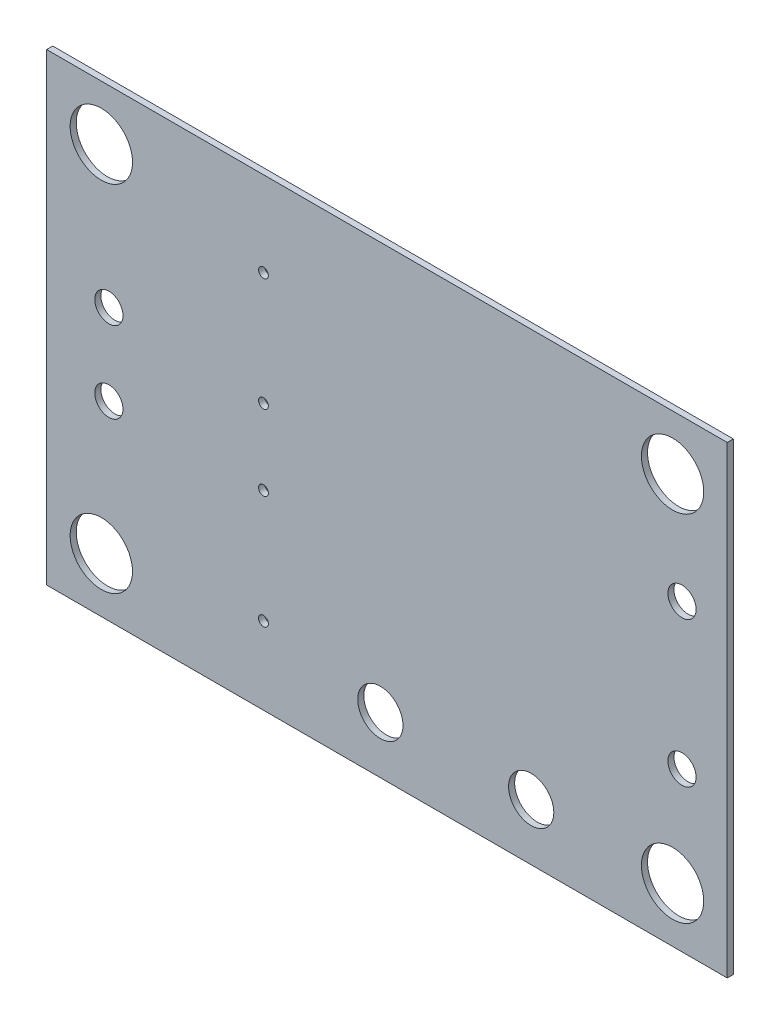
ISO-10303-21;
HEADER;
FILE_DESCRIPTION(('STEP AP214'),'2;1');
FILE_NAME('part.step','',(''),(''),'','','');
FILE_SCHEMA(('AUTOMOTIVE_DESIGN { 1 0 10303 214 1 1 1 1 }'));
ENDSEC;
DATA;
#1=APPLICATION_CONTEXT('core data for automotive mechanical design processes');
#2=APPLICATION_PROTOCOL_DEFINITION('international standard','automotive_design',2000,#1);
#3=PRODUCT_CONTEXT('',#1,'mechanical');
#4=PRODUCT('Part','Part','',(#3));
#5=PRODUCT_RELATED_PRODUCT_CATEGORY('part','',(#4));
#6=PRODUCT_DEFINITION_FORMATION('','',#4);
#7=PRODUCT_DEFINITION_CONTEXT('part definition',#1,'design');
#8=PRODUCT_DEFINITION('design','',#6,#7);
#9=PRODUCT_DEFINITION_SHAPE('','',#8);
#10=(LENGTH_UNIT() NAMED_UNIT(*) SI_UNIT(.MILLI.,.METRE.));
#11=(NAMED_UNIT(*) PLANE_ANGLE_UNIT() SI_UNIT($,.RADIAN.));
#12=(NAMED_UNIT(*) SI_UNIT($,.STERADIAN.) SOLID_ANGLE_UNIT());
#13=UNCERTAINTY_MEASURE_WITH_UNIT(LENGTH_MEASURE(1.E-05),#10,'distance_accuracy_value','');
#14=(GEOMETRIC_REPRESENTATION_CONTEXT(3) GLOBAL_UNCERTAINTY_ASSIGNED_CONTEXT((#13)) GLOBAL_UNIT_ASSIGNED_CONTEXT((#10,
#11,#12)) REPRESENTATION_CONTEXT('',''));
#15=CARTESIAN_POINT('',(0.,0.,0.));
#16=DIRECTION('',(0.,0.,1.));
#17=DIRECTION('',(1.,0.,0.));
#18=AXIS2_PLACEMENT_3D('',#15,#16,#17);
#19=CARTESIAN_POINT('',(115.88750076293,66.29400062561,0.41148));
#20=DIRECTION('',(0.,0.,1.));
#21=DIRECTION('',(1.,0.,0.));
#22=AXIS2_PLACEMENT_3D('',#19,#20,#21);
#23=PLANE('',#22);
#24=CARTESIAN_POINT('',(135.128,78.232,0.41148));
#25=DIRECTION('',(0.,0.,1.));
#26=DIRECTION('',(1.,0.,0.));
#27=AXIS2_PLACEMENT_3D('',#24,#25,#26);
#28=CIRCLE('',#27,2.1);
#29=CARTESIAN_POINT('',(137.228,78.232,0.41148));
#30=VERTEX_POINT('',#29);
#31=EDGE_CURVE('E27',#30,#30,#28,.T.);
#32=ORIENTED_EDGE('',*,*,#31,.F.);
#33=EDGE_LOOP('',(#32));
#34=FACE_BOUND('',#33,.T.);
#35=CARTESIAN_POINT('',(135.763,71.12,0.41148));
#36=DIRECTION('',(0.,0.,1.));
#37=DIRECTION('',(1.,0.,0.));
#38=AXIS2_PLACEMENT_3D('',#35,#36,#37);
#39=CIRCLE('',#38,0.952);
#40=CARTESIAN_POINT('',(136.715,71.12,0.41148));
#41=VERTEX_POINT('',#40);
#42=EDGE_CURVE('E193',#41,#41,#39,.T.);
#43=ORIENTED_EDGE('',*,*,#42,.F.);
#44=EDGE_LOOP('',(#43));
#45=FACE_BOUND('',#44,.T.);
#46=CARTESIAN_POINT('',(107.569,76.2,0.41148));
#47=DIRECTION('',(0.,0.,1.));
#48=DIRECTION('',(1.,0.,0.));
#49=AXIS2_PLACEMENT_3D('',#46,#47,#48);
#50=CIRCLE('',#49,0.33);
#51=CARTESIAN_POINT('',(107.899,76.2,0.41148));
#52=VERTEX_POINT('',#51);
#53=EDGE_CURVE('E185',#52,#52,#50,.T.);
#54=ORIENTED_EDGE('',*,*,#53,.F.);
#55=EDGE_LOOP('',(#54));
#56=FACE_BOUND('',#55,.T.);
#57=CARTESIAN_POINT('',(135.763,61.341,0.41148));
#58=DIRECTION('',(0.,0.,1.));
#59=DIRECTION('',(1.,0.,0.));
#60=AXIS2_PLACEMENT_3D('',#57,#58,#59);
#61=CIRCLE('',#60,0.952);
#62=CARTESIAN_POINT('',(136.715,61.341,0.41148));
#63=VERTEX_POINT('',#62);
#64=EDGE_CURVE('E463',#63,#63,#61,.T.);
#65=ORIENTED_EDGE('',*,*,#64,.F.);
#66=EDGE_LOOP('',(#65));
#67=FACE_BOUND('',#66,.T.);
#68=CARTESIAN_POINT('',(135.128,54.356,0.41148));
#69=DIRECTION('',(0.,0.,1.));
#70=DIRECTION('',(1.,0.,0.));
#71=AXIS2_PLACEMENT_3D('',#68,#69,#70);
#72=CIRCLE('',#71,2.1);
#73=CARTESIAN_POINT('',(137.228,54.356,0.41148));
#74=VERTEX_POINT('',#73);
#75=EDGE_CURVE('E205',#74,#74,#72,.T.);
#76=ORIENTED_EDGE('',*,*,#75,.F.);
#77=EDGE_LOOP('',(#76));
#78=FACE_BOUND('',#77,.T.);
#79=CARTESIAN_POINT('',(125.603,54.483,0.41148));
#80=DIRECTION('',(0.,0.,1.));
#81=DIRECTION('',(1.,0.,0.));
#82=AXIS2_PLACEMENT_3D('',#79,#80,#81);
#83=CIRCLE('',#82,1.524);
#84=CARTESIAN_POINT('',(127.127,54.483,0.41148));
#85=VERTEX_POINT('',#84);
#86=EDGE_CURVE('E329',#85,#85,#83,.T.);
#87=ORIENTED_EDGE('',*,*,#86,.F.);
#88=EDGE_LOOP('',(#87));
#89=FACE_BOUND('',#88,.T.);
#90=CARTESIAN_POINT('',(115.443,54.483,0.41148));
#91=DIRECTION('',(0.,0.,1.));
#92=DIRECTION('',(1.,0.,0.));
#93=AXIS2_PLACEMENT_3D('',#90,#91,#92);
#94=CIRCLE('',#93,1.524);
#95=CARTESIAN_POINT('',(116.967,54.483,0.41148));
#96=VERTEX_POINT('',#95);
#97=EDGE_CURVE('E213',#96,#96,#94,.T.);
#98=ORIENTED_EDGE('',*,*,#97,.F.);
#99=EDGE_LOOP('',(#98));
#100=FACE_BOUND('',#99,.T.);
#101=CARTESIAN_POINT('',(107.569,68.58,0.41148));
#102=DIRECTION('',(0.,0.,1.));
#103=DIRECTION('',(1.,0.,0.));
#104=AXIS2_PLACEMENT_3D('',#101,#102,#103);
#105=CIRCLE('',#104,0.33);
#106=CARTESIAN_POINT('',(107.899,68.58,0.41148));
#107=VERTEX_POINT('',#106);
#108=EDGE_CURVE('E231',#107,#107,#105,.T.);
#109=ORIENTED_EDGE('',*,*,#108,.F.);
#110=EDGE_LOOP('',(#109));
#111=FACE_BOUND('',#110,.T.);
#112=CARTESIAN_POINT('',(107.569,63.5,0.41148));
#113=DIRECTION('',(0.,0.,1.));
#114=DIRECTION('',(1.,0.,0.));
#115=AXIS2_PLACEMENT_3D('',#112,#113,#114);
#116=CIRCLE('',#115,0.33);
#117=CARTESIAN_POINT('',(107.899,63.5,0.41148));
#118=VERTEX_POINT('',#117);
#119=EDGE_CURVE('E404',#118,#118,#116,.T.);
#120=ORIENTED_EDGE('',*,*,#119,.F.);
#121=EDGE_LOOP('',(#120));
#122=FACE_BOUND('',#121,.T.);
#123=CARTESIAN_POINT('',(96.647,78.232,0.41148));
#124=DIRECTION('',(0.,0.,1.));
#125=DIRECTION('',(1.,0.,0.));
#126=AXIS2_PLACEMENT_3D('',#123,#124,#125);
#127=CIRCLE('',#126,2.1);
#128=CARTESIAN_POINT('',(98.747,78.232,0.41148));
#129=VERTEX_POINT('',#128);
#130=EDGE_CURVE('E244',#129,#129,#127,.T.);
#131=ORIENTED_EDGE('',*,*,#130,.F.);
#132=EDGE_LOOP('',(#131));
#133=FACE_BOUND('',#132,.T.);
#134=CARTESIAN_POINT('',(97.155,68.961,0.41148));
#135=DIRECTION('',(0.,0.,1.));
#136=DIRECTION('',(1.,0.,0.));
#137=AXIS2_PLACEMENT_3D('',#134,#135,#136);
#138=CIRCLE('',#137,0.952);
#139=CARTESIAN_POINT('',(98.107,68.961,0.41148));
#140=VERTEX_POINT('',#139);
#141=EDGE_CURVE('E302',#140,#140,#138,.T.);
#142=ORIENTED_EDGE('',*,*,#141,.F.);
#143=EDGE_LOOP('',(#142));
#144=FACE_BOUND('',#143,.T.);
#145=CARTESIAN_POINT('',(96.647,54.356,0.41148));
#146=DIRECTION('',(0.,0.,1.));
#147=DIRECTION('',(1.,0.,0.));
#148=AXIS2_PLACEMENT_3D('',#145,#146,#147);
#149=CIRCLE('',#148,2.1);
#150=CARTESIAN_POINT('',(98.747,54.356,0.41148));
#151=VERTEX_POINT('',#150);
#152=EDGE_CURVE('E247',#151,#151,#149,.T.);
#153=ORIENTED_EDGE('',*,*,#152,.F.);
#154=EDGE_LOOP('',(#153));
#155=FACE_BOUND('',#154,.T.);
#156=CARTESIAN_POINT('',(107.569,55.88,0.41148));
#157=DIRECTION('',(0.,0.,1.));
#158=DIRECTION('',(1.,0.,0.));
#159=AXIS2_PLACEMENT_3D('',#156,#157,#158);
#160=CIRCLE('',#159,0.33);
#161=CARTESIAN_POINT('',(107.899,55.88,0.41148));
#162=VERTEX_POINT('',#161);
#163=EDGE_CURVE('E222',#162,#162,#160,.T.);
#164=ORIENTED_EDGE('',*,*,#163,.F.);
#165=EDGE_LOOP('',(#164));
#166=FACE_BOUND('',#165,.T.);
#167=CARTESIAN_POINT('',(97.155,63.5,0.41148));
#168=DIRECTION('',(0.,0.,1.));
#169=DIRECTION('',(1.,0.,0.));
#170=AXIS2_PLACEMENT_3D('',#167,#168,#169);
#171=CIRCLE('',#170,0.952);
#172=CARTESIAN_POINT('',(98.107,63.5,0.41148));
#173=VERTEX_POINT('',#172);
#174=EDGE_CURVE('E293',#173,#173,#171,.T.);
#175=ORIENTED_EDGE('',*,*,#174,.F.);
#176=EDGE_LOOP('',(#175));
#177=FACE_BOUND('',#176,.T.);
#178=DIRECTION('',(1.,0.,0.));
#179=VECTOR('',#178,1.);
#180=CARTESIAN_POINT('',(92.963996887207,50.673000335693,0.41148));
#181=LINE('',#180,#179);
#182=CARTESIAN_POINT('',(92.963996887207,50.673000335693,0.41148));
#183=VERTEX_POINT('',#182);
#184=CARTESIAN_POINT('',(138.81100463867,50.673000335693,0.41148));
#185=VERTEX_POINT('',#184);
#186=EDGE_CURVE('E318',#183,#185,#181,.T.);
#187=ORIENTED_EDGE('',*,*,#186,.T.);
#188=DIRECTION('',(0.,1.,0.));
#189=VECTOR('',#188,1.);
#190=CARTESIAN_POINT('',(138.81100463867,50.673000335693,0.41148));
#191=LINE('',#190,#189);
#192=CARTESIAN_POINT('',(138.81100463867,81.915000915527,0.41148));
#193=VERTEX_POINT('',#192);
#194=EDGE_CURVE('E348',#185,#193,#191,.T.);
#195=ORIENTED_EDGE('',*,*,#194,.T.);
#196=DIRECTION('',(-1.,0.,0.));
#197=VECTOR('',#196,1.);
#198=CARTESIAN_POINT('',(138.81100463867,81.915000915527,0.41148));
#199=LINE('',#198,#197);
#200=CARTESIAN_POINT('',(92.963996887207,81.915000915527,0.41148));
#201=VERTEX_POINT('',#200);
#202=EDGE_CURVE('E20',#193,#201,#199,.T.);
#203=ORIENTED_EDGE('',*,*,#202,.T.);
#204=DIRECTION('',(0.,-1.,0.));
#205=VECTOR('',#204,1.);
#206=CARTESIAN_POINT('',(92.963996887207,81.915000915527,0.41148));
#207=LINE('',#206,#205);
#208=EDGE_CURVE('E223',#201,#183,#207,.T.);
#209=ORIENTED_EDGE('',*,*,#208,.T.);
#210=EDGE_LOOP('',(#187,#195,#203,#209));
#211=FACE_BOUND('',#210,.T.);
#212=ADVANCED_FACE('F16',(#34,#45,#56,#67,#78,#89,#100,#111,#122,#133,#144,#155,#166,#177,#211),
#23,.T.);
#213=CARTESIAN_POINT('',(115.88750076293,66.29400062561,0.));
#214=DIRECTION('',(0.,0.,1.));
#215=DIRECTION('',(1.,0.,0.));
#216=AXIS2_PLACEMENT_3D('',#213,#214,#215);
#217=PLANE('',#216);
#218=CARTESIAN_POINT('',(135.128,78.232,0.));
#219=DIRECTION('',(0.,0.,1.));
#220=DIRECTION('',(1.,0.,0.));
#221=AXIS2_PLACEMENT_3D('',#218,#219,#220);
#222=CIRCLE('',#221,2.1);
#223=CARTESIAN_POINT('',(137.228,78.232,0.));
#224=VERTEX_POINT('',#223);
#225=EDGE_CURVE('E11',#224,#224,#222,.T.);
#226=ORIENTED_EDGE('',*,*,#225,.T.);
#227=EDGE_LOOP('',(#226));
#228=FACE_BOUND('',#227,.T.);
#229=CARTESIAN_POINT('',(135.763,71.12,0.));
#230=DIRECTION('',(0.,0.,1.));
#231=DIRECTION('',(1.,0.,0.));
#232=AXIS2_PLACEMENT_3D('',#229,#230,#231);
#233=CIRCLE('',#232,0.952);
#234=CARTESIAN_POINT('',(136.715,71.12,0.));
#235=VERTEX_POINT('',#234);
#236=EDGE_CURVE('E234',#235,#235,#233,.T.);
#237=ORIENTED_EDGE('',*,*,#236,.T.);
#238=EDGE_LOOP('',(#237));
#239=FACE_BOUND('',#238,.T.);
#240=CARTESIAN_POINT('',(107.569,76.2,0.));
#241=DIRECTION('',(0.,0.,1.));
#242=DIRECTION('',(1.,0.,0.));
#243=AXIS2_PLACEMENT_3D('',#240,#241,#242);
#244=CIRCLE('',#243,0.33);
#245=CARTESIAN_POINT('',(107.899,76.2,0.));
#246=VERTEX_POINT('',#245);
#247=EDGE_CURVE('E177',#246,#246,#244,.T.);
#248=ORIENTED_EDGE('',*,*,#247,.T.);
#249=EDGE_LOOP('',(#248));
#250=FACE_BOUND('',#249,.T.);
#251=CARTESIAN_POINT('',(135.763,61.341,0.));
#252=DIRECTION('',(0.,0.,1.));
#253=DIRECTION('',(1.,0.,0.));
#254=AXIS2_PLACEMENT_3D('',#251,#252,#253);
#255=CIRCLE('',#254,0.952);
#256=CARTESIAN_POINT('',(136.715,61.341,0.));
#257=VERTEX_POINT('',#256);
#258=EDGE_CURVE('E450',#257,#257,#255,.T.);
#259=ORIENTED_EDGE('',*,*,#258,.T.);
#260=EDGE_LOOP('',(#259));
#261=FACE_BOUND('',#260,.T.);
#262=CARTESIAN_POINT('',(135.128,54.356,0.));
#263=DIRECTION('',(0.,0.,1.));
#264=DIRECTION('',(1.,0.,0.));
#265=AXIS2_PLACEMENT_3D('',#262,#263,#264);
#266=CIRCLE('',#265,2.1);
#267=CARTESIAN_POINT('',(137.228,54.356,0.));
#268=VERTEX_POINT('',#267);
#269=EDGE_CURVE('E483',#268,#268,#266,.T.);
#270=ORIENTED_EDGE('',*,*,#269,.T.);
#271=EDGE_LOOP('',(#270));
#272=FACE_BOUND('',#271,.T.);
#273=CARTESIAN_POINT('',(125.603,54.483,0.));
#274=DIRECTION('',(0.,0.,1.));
#275=DIRECTION('',(1.,0.,0.));
#276=AXIS2_PLACEMENT_3D('',#273,#274,#275);
#277=CIRCLE('',#276,1.524);
#278=CARTESIAN_POINT('',(127.127,54.483,0.));
#279=VERTEX_POINT('',#278);
#280=EDGE_CURVE('E206',#279,#279,#277,.T.);
#281=ORIENTED_EDGE('',*,*,#280,.T.);
#282=EDGE_LOOP('',(#281));
#283=FACE_BOUND('',#282,.T.);
#284=CARTESIAN_POINT('',(115.443,54.483,0.));
#285=DIRECTION('',(0.,0.,1.));
#286=DIRECTION('',(1.,0.,0.));
#287=AXIS2_PLACEMENT_3D('',#284,#285,#286);
#288=CIRCLE('',#287,1.524);
#289=CARTESIAN_POINT('',(116.967,54.483,0.));
#290=VERTEX_POINT('',#289);
#291=EDGE_CURVE('E216',#290,#290,#288,.T.);
#292=ORIENTED_EDGE('',*,*,#291,.T.);
#293=EDGE_LOOP('',(#292));
#294=FACE_BOUND('',#293,.T.);
#295=CARTESIAN_POINT('',(107.569,68.58,0.));
#296=DIRECTION('',(0.,0.,1.));
#297=DIRECTION('',(1.,0.,0.));
#298=AXIS2_PLACEMENT_3D('',#295,#296,#297);
#299=CIRCLE('',#298,0.33);
#300=CARTESIAN_POINT('',(107.899,68.58,0.));
#301=VERTEX_POINT('',#300);
#302=EDGE_CURVE('E228',#301,#301,#299,.T.);
#303=ORIENTED_EDGE('',*,*,#302,.T.);
#304=EDGE_LOOP('',(#303));
#305=FACE_BOUND('',#304,.T.);
#306=CARTESIAN_POINT('',(107.569,63.5,0.));
#307=DIRECTION('',(0.,0.,1.));
#308=DIRECTION('',(1.,0.,0.));
#309=AXIS2_PLACEMENT_3D('',#306,#307,#308);
#310=CIRCLE('',#309,0.33);
#311=CARTESIAN_POINT('',(107.899,63.5,0.));
#312=VERTEX_POINT('',#311);
#313=EDGE_CURVE('E397',#312,#312,#310,.T.);
#314=ORIENTED_EDGE('',*,*,#313,.T.);
#315=EDGE_LOOP('',(#314));
#316=FACE_BOUND('',#315,.T.);
#317=CARTESIAN_POINT('',(96.647,78.232,0.));
#318=DIRECTION('',(0.,0.,1.));
#319=DIRECTION('',(1.,0.,0.));
#320=AXIS2_PLACEMENT_3D('',#317,#318,#319);
#321=CIRCLE('',#320,2.1);
#322=CARTESIAN_POINT('',(98.747,78.232,0.));
#323=VERTEX_POINT('',#322);
#324=EDGE_CURVE('E240',#323,#323,#321,.T.);
#325=ORIENTED_EDGE('',*,*,#324,.T.);
#326=EDGE_LOOP('',(#325));
#327=FACE_BOUND('',#326,.T.);
#328=CARTESIAN_POINT('',(97.155,68.961,0.));
#329=DIRECTION('',(0.,0.,1.));
#330=DIRECTION('',(1.,0.,0.));
#331=AXIS2_PLACEMENT_3D('',#328,#329,#330);
#332=CIRCLE('',#331,0.952);
#333=CARTESIAN_POINT('',(98.107,68.961,0.));
#334=VERTEX_POINT('',#333);
#335=EDGE_CURVE('E297',#334,#334,#332,.T.);
#336=ORIENTED_EDGE('',*,*,#335,.T.);
#337=EDGE_LOOP('',(#336));
#338=FACE_BOUND('',#337,.T.);
#339=CARTESIAN_POINT('',(96.647,54.356,0.));
#340=DIRECTION('',(0.,0.,1.));
#341=DIRECTION('',(1.,0.,0.));
#342=AXIS2_PLACEMENT_3D('',#339,#340,#341);
#343=CIRCLE('',#342,2.1);
#344=CARTESIAN_POINT('',(98.747,54.356,0.));
#345=VERTEX_POINT('',#344);
#346=EDGE_CURVE('E428',#345,#345,#343,.T.);
#347=ORIENTED_EDGE('',*,*,#346,.T.);
#348=EDGE_LOOP('',(#347));
#349=FACE_BOUND('',#348,.T.);
#350=CARTESIAN_POINT('',(107.569,55.88,0.));
#351=DIRECTION('',(0.,0.,1.));
#352=DIRECTION('',(1.,0.,0.));
#353=AXIS2_PLACEMENT_3D('',#350,#351,#352);
#354=CIRCLE('',#353,0.33);
#355=CARTESIAN_POINT('',(107.899,55.88,0.));
#356=VERTEX_POINT('',#355);
#357=EDGE_CURVE('E218',#356,#356,#354,.T.);
#358=ORIENTED_EDGE('',*,*,#357,.T.);
#359=EDGE_LOOP('',(#358));
#360=FACE_BOUND('',#359,.T.);
#361=CARTESIAN_POINT('',(97.155,63.5,0.));
#362=DIRECTION('',(0.,0.,1.));
#363=DIRECTION('',(1.,0.,0.));
#364=AXIS2_PLACEMENT_3D('',#361,#362,#363);
#365=CIRCLE('',#364,0.952);
#366=CARTESIAN_POINT('',(98.107,63.5,0.));
#367=VERTEX_POINT('',#366);
#368=EDGE_CURVE('E284',#367,#367,#365,.T.);
#369=ORIENTED_EDGE('',*,*,#368,.T.);
#370=EDGE_LOOP('',(#369));
#371=FACE_BOUND('',#370,.T.);
#372=DIRECTION('',(0.,-1.,0.));
#373=VECTOR('',#372,1.);
#374=CARTESIAN_POINT('',(92.963996887207,81.915000915527,0.));
#375=LINE('',#374,#373);
#376=CARTESIAN_POINT('',(92.963996887207,81.915000915527,0.));
#377=VERTEX_POINT('',#376);
#378=CARTESIAN_POINT('',(92.963996887207,50.673000335693,0.));
#379=VERTEX_POINT('',#378);
#380=EDGE_CURVE('E227',#377,#379,#375,.T.);
#381=ORIENTED_EDGE('',*,*,#380,.F.);
#382=DIRECTION('',(-1.,0.,0.));
#383=VECTOR('',#382,1.);
#384=CARTESIAN_POINT('',(138.81100463867,81.915000915527,0.));
#385=LINE('',#384,#383);
#386=CARTESIAN_POINT('',(138.81100463867,81.915000915527,0.));
#387=VERTEX_POINT('',#386);
#388=EDGE_CURVE('E198',#387,#377,#385,.T.);
#389=ORIENTED_EDGE('',*,*,#388,.F.);
#390=DIRECTION('',(0.,1.,0.));
#391=VECTOR('',#390,1.);
#392=CARTESIAN_POINT('',(138.81100463867,50.673000335693,0.));
#393=LINE('',#392,#391);
#394=CARTESIAN_POINT('',(138.81100463867,50.673000335693,0.));
#395=VERTEX_POINT('',#394);
#396=EDGE_CURVE('E207',#395,#387,#393,.T.);
#397=ORIENTED_EDGE('',*,*,#396,.F.);
#398=DIRECTION('',(1.,0.,0.));
#399=VECTOR('',#398,1.);
#400=CARTESIAN_POINT('',(92.963996887207,50.673000335693,0.));
#401=LINE('',#400,#399);
#402=EDGE_CURVE('E319',#379,#395,#401,.T.);
#403=ORIENTED_EDGE('',*,*,#402,.F.);
#404=EDGE_LOOP('',(#381,#389,#397,#403));
#405=FACE_BOUND('',#404,.T.);
#406=ADVANCED_FACE('F178',(#228,#239,#250,#261,#272,#283,#294,#305,#316,#327,#338,#349,#360,
#371,#405),#217,.F.);
#407=CARTESIAN_POINT('',(135.128,78.232,0.));
#408=DIRECTION('',(0.,0.,-1.));
#409=DIRECTION('',(1.,0.,0.));
#410=AXIS2_PLACEMENT_3D('',#407,#408,#409);
#411=CYLINDRICAL_SURFACE('',#410,2.1);
#412=DIRECTION('',(0.,0.,1.));
#413=VECTOR('',#412,1.);
#414=CARTESIAN_POINT('',(137.228,78.232,0.));
#415=LINE('',#414,#413);
#416=EDGE_CURVE('E237',#224,#30,#415,.T.);
#417=ORIENTED_EDGE('',*,*,#416,.T.);
#418=ORIENTED_EDGE('',*,*,#31,.T.);
#419=ORIENTED_EDGE('',*,*,#416,.F.);
#420=ORIENTED_EDGE('',*,*,#225,.F.);
#421=EDGE_LOOP('',(#417,#418,#419,#420));
#422=FACE_BOUND('',#421,.T.);
#423=ADVANCED_FACE('F546',(#422),#411,.F.);
#424=CARTESIAN_POINT('',(135.763,71.12,0.));
#425=DIRECTION('',(0.,0.,-1.));
#426=DIRECTION('',(1.,0.,0.));
#427=AXIS2_PLACEMENT_3D('',#424,#425,#426);
#428=CYLINDRICAL_SURFACE('',#427,0.952);
#429=DIRECTION('',(0.,0.,1.));
#430=VECTOR('',#429,1.);
#431=CARTESIAN_POINT('',(136.715,71.12,0.));
#432=LINE('',#431,#430);
#433=EDGE_CURVE('E184',#235,#41,#432,.T.);
#434=ORIENTED_EDGE('',*,*,#433,.T.);
#435=ORIENTED_EDGE('',*,*,#42,.T.);
#436=ORIENTED_EDGE('',*,*,#433,.F.);
#437=ORIENTED_EDGE('',*,*,#236,.F.);
#438=EDGE_LOOP('',(#434,#435,#436,#437));
#439=FACE_BOUND('',#438,.T.);
#440=ADVANCED_FACE('F620',(#439),#428,.F.);
#441=CARTESIAN_POINT('',(107.569,76.2,0.));
#442=DIRECTION('',(0.,0.,-1.));
#443=DIRECTION('',(1.,0.,0.));
#444=AXIS2_PLACEMENT_3D('',#441,#442,#443);
#445=CYLINDRICAL_SURFACE('',#444,0.33);
#446=DIRECTION('',(0.,0.,1.));
#447=VECTOR('',#446,1.);
#448=CARTESIAN_POINT('',(107.899,76.2,0.));
#449=LINE('',#448,#447);
#450=EDGE_CURVE('E195',#246,#52,#449,.T.);
#451=ORIENTED_EDGE('',*,*,#450,.T.);
#452=ORIENTED_EDGE('',*,*,#53,.T.);
#453=ORIENTED_EDGE('',*,*,#450,.F.);
#454=ORIENTED_EDGE('',*,*,#247,.F.);
#455=EDGE_LOOP('',(#451,#452,#453,#454));
#456=FACE_BOUND('',#455,.T.);
#457=ADVANCED_FACE('F571',(#456),#445,.F.);
#458=CARTESIAN_POINT('',(135.763,61.341,0.));
#459=DIRECTION('',(0.,0.,-1.));
#460=DIRECTION('',(1.,0.,0.));
#461=AXIS2_PLACEMENT_3D('',#458,#459,#460);
#462=CYLINDRICAL_SURFACE('',#461,0.952);
#463=DIRECTION('',(0.,0.,1.));
#464=VECTOR('',#463,1.);
#465=CARTESIAN_POINT('',(136.715,61.341,0.));
#466=LINE('',#465,#464);
#467=EDGE_CURVE('E467',#257,#63,#466,.T.);
#468=ORIENTED_EDGE('',*,*,#467,.T.);
#469=ORIENTED_EDGE('',*,*,#64,.T.);
#470=ORIENTED_EDGE('',*,*,#467,.F.);
#471=ORIENTED_EDGE('',*,*,#258,.F.);
#472=EDGE_LOOP('',(#468,#469,#470,#471));
#473=FACE_BOUND('',#472,.T.);
#474=ADVANCED_FACE('F565',(#473),#462,.F.);
#475=CARTESIAN_POINT('',(135.128,54.356,0.));
#476=DIRECTION('',(0.,0.,-1.));
#477=DIRECTION('',(1.,0.,0.));
#478=AXIS2_PLACEMENT_3D('',#475,#476,#477);
#479=CYLINDRICAL_SURFACE('',#478,2.1);
#480=DIRECTION('',(0.,0.,1.));
#481=VECTOR('',#480,1.);
#482=CARTESIAN_POINT('',(137.228,54.356,0.));
#483=LINE('',#482,#481);
#484=EDGE_CURVE('E201',#268,#74,#483,.T.);
#485=ORIENTED_EDGE('',*,*,#484,.T.);
#486=ORIENTED_EDGE('',*,*,#75,.T.);
#487=ORIENTED_EDGE('',*,*,#484,.F.);
#488=ORIENTED_EDGE('',*,*,#269,.F.);
#489=EDGE_LOOP('',(#485,#486,#487,#488));
#490=FACE_BOUND('',#489,.T.);
#491=ADVANCED_FACE('F570',(#490),#479,.F.);
#492=CARTESIAN_POINT('',(125.603,54.483,0.));
#493=DIRECTION('',(0.,0.,-1.));
#494=DIRECTION('',(1.,0.,0.));
#495=AXIS2_PLACEMENT_3D('',#492,#493,#494);
#496=CYLINDRICAL_SURFACE('',#495,1.524);
#497=DIRECTION('',(0.,0.,1.));
#498=VECTOR('',#497,1.);
#499=CARTESIAN_POINT('',(127.127,54.483,0.));
#500=LINE('',#499,#498);
#501=EDGE_CURVE('E324',#279,#85,#500,.T.);
#502=ORIENTED_EDGE('',*,*,#501,.T.);
#503=ORIENTED_EDGE('',*,*,#86,.T.);
#504=ORIENTED_EDGE('',*,*,#501,.F.);
#505=ORIENTED_EDGE('',*,*,#280,.F.);
#506=EDGE_LOOP('',(#502,#503,#504,#505));
#507=FACE_BOUND('',#506,.T.);
#508=ADVANCED_FACE('F581',(#507),#496,.F.);
#509=CARTESIAN_POINT('',(115.443,54.483,0.));
#510=DIRECTION('',(0.,0.,-1.));
#511=DIRECTION('',(1.,0.,0.));
#512=AXIS2_PLACEMENT_3D('',#509,#510,#511);
#513=CYLINDRICAL_SURFACE('',#512,1.524);
#514=DIRECTION('',(0.,0.,1.));
#515=VECTOR('',#514,1.);
#516=CARTESIAN_POINT('',(116.967,54.483,0.));
#517=LINE('',#516,#515);
#518=EDGE_CURVE('E217',#290,#96,#517,.T.);
#519=ORIENTED_EDGE('',*,*,#518,.T.);
#520=ORIENTED_EDGE('',*,*,#97,.T.);
#521=ORIENTED_EDGE('',*,*,#518,.F.);
#522=ORIENTED_EDGE('',*,*,#291,.F.);
#523=EDGE_LOOP('',(#519,#520,#521,#522));
#524=FACE_BOUND('',#523,.T.);
#525=ADVANCED_FACE('F645',(#524),#513,.F.);
#526=CARTESIAN_POINT('',(107.569,68.58,0.));
#527=DIRECTION('',(0.,0.,-1.));
#528=DIRECTION('',(1.,0.,0.));
#529=AXIS2_PLACEMENT_3D('',#526,#527,#528);
#530=CYLINDRICAL_SURFACE('',#529,0.33);
#531=DIRECTION('',(0.,0.,1.));
#532=VECTOR('',#531,1.);
#533=CARTESIAN_POINT('',(107.899,68.58,0.));
#534=LINE('',#533,#532);
#535=EDGE_CURVE('E389',#301,#107,#534,.T.);
#536=ORIENTED_EDGE('',*,*,#535,.T.);
#537=ORIENTED_EDGE('',*,*,#108,.T.);
#538=ORIENTED_EDGE('',*,*,#535,.F.);
#539=ORIENTED_EDGE('',*,*,#302,.F.);
#540=EDGE_LOOP('',(#536,#537,#538,#539));
#541=FACE_BOUND('',#540,.T.);
#542=ADVANCED_FACE('F18',(#541),#530,.F.);
#543=CARTESIAN_POINT('',(107.569,63.5,0.));
#544=DIRECTION('',(0.,0.,-1.));
#545=DIRECTION('',(1.,0.,0.));
#546=AXIS2_PLACEMENT_3D('',#543,#544,#545);
#547=CYLINDRICAL_SURFACE('',#546,0.33);
#548=DIRECTION('',(0.,0.,1.));
#549=VECTOR('',#548,1.);
#550=CARTESIAN_POINT('',(107.899,63.5,0.));
#551=LINE('',#550,#549);
#552=EDGE_CURVE('E243',#312,#118,#551,.T.);
#553=ORIENTED_EDGE('',*,*,#552,.T.);
#554=ORIENTED_EDGE('',*,*,#119,.T.);
#555=ORIENTED_EDGE('',*,*,#552,.F.);
#556=ORIENTED_EDGE('',*,*,#313,.F.);
#557=EDGE_LOOP('',(#553,#554,#555,#556));
#558=FACE_BOUND('',#557,.T.);
#559=ADVANCED_FACE('F625',(#558),#547,.F.);
#560=CARTESIAN_POINT('',(96.647,78.232,0.));
#561=DIRECTION('',(0.,0.,-1.));
#562=DIRECTION('',(1.,0.,0.));
#563=AXIS2_PLACEMENT_3D('',#560,#561,#562);
#564=CYLINDRICAL_SURFACE('',#563,2.1);
#565=DIRECTION('',(0.,0.,1.));
#566=VECTOR('',#565,1.);
#567=CARTESIAN_POINT('',(98.747,78.232,0.));
#568=LINE('',#567,#566);
#569=EDGE_CURVE('E301',#323,#129,#568,.T.);
#570=ORIENTED_EDGE('',*,*,#569,.T.);
#571=ORIENTED_EDGE('',*,*,#130,.T.);
#572=ORIENTED_EDGE('',*,*,#569,.F.);
#573=ORIENTED_EDGE('',*,*,#324,.F.);
#574=EDGE_LOOP('',(#570,#571,#572,#573));
#575=FACE_BOUND('',#574,.T.);
#576=ADVANCED_FACE('F600',(#575),#564,.F.);
#577=CARTESIAN_POINT('',(97.155,68.961,0.));
#578=DIRECTION('',(0.,0.,-1.));
#579=DIRECTION('',(1.,0.,0.));
#580=AXIS2_PLACEMENT_3D('',#577,#578,#579);
#581=CYLINDRICAL_SURFACE('',#580,0.952);
#582=DIRECTION('',(0.,0.,1.));
#583=VECTOR('',#582,1.);
#584=CARTESIAN_POINT('',(98.107,68.961,0.));
#585=LINE('',#584,#583);
#586=EDGE_CURVE('E436',#334,#140,#585,.T.);
#587=ORIENTED_EDGE('',*,*,#586,.T.);
#588=ORIENTED_EDGE('',*,*,#141,.T.);
#589=ORIENTED_EDGE('',*,*,#586,.F.);
#590=ORIENTED_EDGE('',*,*,#335,.F.);
#591=EDGE_LOOP('',(#587,#588,#589,#590));
#592=FACE_BOUND('',#591,.T.);
#593=ADVANCED_FACE('F591',(#592),#581,.F.);
#594=CARTESIAN_POINT('',(96.647,54.356,0.));
#595=DIRECTION('',(0.,0.,-1.));
#596=DIRECTION('',(1.,0.,0.));
#597=AXIS2_PLACEMENT_3D('',#594,#595,#596);
#598=CYLINDRICAL_SURFACE('',#597,2.1);
#599=DIRECTION('',(0.,0.,1.));
#600=VECTOR('',#599,1.);
#601=CARTESIAN_POINT('',(98.747,54.356,0.));
#602=LINE('',#601,#600);
#603=EDGE_CURVE('E221',#345,#151,#602,.T.);
#604=ORIENTED_EDGE('',*,*,#603,.T.);
#605=ORIENTED_EDGE('',*,*,#152,.T.);
#606=ORIENTED_EDGE('',*,*,#603,.F.);
#607=ORIENTED_EDGE('',*,*,#346,.F.);
#608=EDGE_LOOP('',(#604,#605,#606,#607));
#609=FACE_BOUND('',#608,.T.);
#610=ADVANCED_FACE('F586',(#609),#598,.F.);
#611=CARTESIAN_POINT('',(107.569,55.88,0.));
#612=DIRECTION('',(0.,0.,-1.));
#613=DIRECTION('',(1.,0.,0.));
#614=AXIS2_PLACEMENT_3D('',#611,#612,#613);
#615=CYLINDRICAL_SURFACE('',#614,0.33);
#616=DIRECTION('',(0.,0.,1.));
#617=VECTOR('',#616,1.);
#618=CARTESIAN_POINT('',(107.899,55.88,0.));
#619=LINE('',#618,#617);
#620=EDGE_CURVE('E279',#356,#162,#619,.T.);
#621=ORIENTED_EDGE('',*,*,#620,.T.);
#622=ORIENTED_EDGE('',*,*,#163,.T.);
#623=ORIENTED_EDGE('',*,*,#620,.F.);
#624=ORIENTED_EDGE('',*,*,#357,.F.);
#625=EDGE_LOOP('',(#621,#622,#623,#624));
#626=FACE_BOUND('',#625,.T.);
#627=ADVANCED_FACE('F513',(#626),#615,.F.);
#628=CARTESIAN_POINT('',(97.155,63.5,0.));
#629=DIRECTION('',(0.,0.,-1.));
#630=DIRECTION('',(1.,0.,0.));
#631=AXIS2_PLACEMENT_3D('',#628,#629,#630);
#632=CYLINDRICAL_SURFACE('',#631,0.952);
#633=DIRECTION('',(0.,0.,1.));
#634=VECTOR('',#633,1.);
#635=CARTESIAN_POINT('',(98.107,63.5,0.));
#636=LINE('',#635,#634);
#637=EDGE_CURVE('E226',#367,#173,#636,.T.);
#638=ORIENTED_EDGE('',*,*,#637,.T.);
#639=ORIENTED_EDGE('',*,*,#174,.T.);
#640=ORIENTED_EDGE('',*,*,#637,.F.);
#641=ORIENTED_EDGE('',*,*,#368,.F.);
#642=EDGE_LOOP('',(#638,#639,#640,#641));
#643=FACE_BOUND('',#642,.T.);
#644=ADVANCED_FACE('F553',(#643),#632,.F.);
#645=CARTESIAN_POINT('',(92.963996887207,81.915000915527,0.));
#646=DIRECTION('',(1.,0.,0.));
#647=DIRECTION('',(0.,1.,0.));
#648=AXIS2_PLACEMENT_3D('',#645,#646,#647);
#649=PLANE('',#648);
#650=ORIENTED_EDGE('',*,*,#380,.T.);
#651=DIRECTION('',(0.,0.,1.));
#652=VECTOR('',#651,1.);
#653=CARTESIAN_POINT('',(92.963996887207,50.673000335693,0.));
#654=LINE('',#653,#652);
#655=EDGE_CURVE('E211',#379,#183,#654,.T.);
#656=ORIENTED_EDGE('',*,*,#655,.T.);
#657=ORIENTED_EDGE('',*,*,#208,.F.);
#658=DIRECTION('',(0.,0.,1.));
#659=VECTOR('',#658,1.);
#660=CARTESIAN_POINT('',(92.963996887207,81.915000915527,0.));
#661=LINE('',#660,#659);
#662=EDGE_CURVE('E354',#377,#201,#661,.T.);
#663=ORIENTED_EDGE('',*,*,#662,.F.);
#664=EDGE_LOOP('',(#650,#656,#657,#663));
#665=FACE_BOUND('',#664,.T.);
#666=ADVANCED_FACE('F558',(#665),#649,.F.);
#667=CARTESIAN_POINT('',(138.81100463867,81.915000915527,0.));
#668=DIRECTION('',(0.,-1.,0.));
#669=DIRECTION('',(0.,0.,-1.));
#670=AXIS2_PLACEMENT_3D('',#667,#668,#669);
#671=PLANE('',#670);
#672=ORIENTED_EDGE('',*,*,#388,.T.);
#673=ORIENTED_EDGE('',*,*,#662,.T.);
#674=ORIENTED_EDGE('',*,*,#202,.F.);
#675=DIRECTION('',(0.,0.,1.));
#676=VECTOR('',#675,1.);
#677=CARTESIAN_POINT('',(138.81100463867,81.915000915527,0.));
#678=LINE('',#677,#676);
#679=EDGE_CURVE('E210',#387,#193,#678,.T.);
#680=ORIENTED_EDGE('',*,*,#679,.F.);
#681=EDGE_LOOP('',(#672,#673,#674,#680));
#682=FACE_BOUND('',#681,.T.);
#683=ADVANCED_FACE('F531',(#682),#671,.F.);
#684=CARTESIAN_POINT('',(138.81100463867,50.673000335693,0.));
#685=DIRECTION('',(-1.,0.,0.));
#686=DIRECTION('',(0.,0.,1.));
#687=AXIS2_PLACEMENT_3D('',#684,#685,#686);
#688=PLANE('',#687);
#689=ORIENTED_EDGE('',*,*,#396,.T.);
#690=ORIENTED_EDGE('',*,*,#679,.T.);
#691=ORIENTED_EDGE('',*,*,#194,.F.);
#692=DIRECTION('',(0.,0.,1.));
#693=VECTOR('',#692,1.);
#694=CARTESIAN_POINT('',(138.81100463867,50.673000335693,0.));
#695=LINE('',#694,#693);
#696=EDGE_CURVE('E313',#395,#185,#695,.T.);
#697=ORIENTED_EDGE('',*,*,#696,.F.);
#698=EDGE_LOOP('',(#689,#690,#691,#697));
#699=FACE_BOUND('',#698,.T.);
#700=ADVANCED_FACE('F528',(#699),#688,.F.);
#701=CARTESIAN_POINT('',(92.963996887207,50.673000335693,0.));
#702=DIRECTION('',(0.,1.,0.));
#703=DIRECTION('',(1.,0.,0.));
#704=AXIS2_PLACEMENT_3D('',#701,#702,#703);
#705=PLANE('',#704);
#706=ORIENTED_EDGE('',*,*,#402,.T.);
#707=ORIENTED_EDGE('',*,*,#696,.T.);
#708=ORIENTED_EDGE('',*,*,#186,.F.);
#709=ORIENTED_EDGE('',*,*,#655,.F.);
#710=EDGE_LOOP('',(#706,#707,#708,#709));
#711=FACE_BOUND('',#710,.T.);
#712=ADVANCED_FACE('F526',(#711),#705,.F.);
#713=CLOSED_SHELL('',(#212,#406,#423,#440,#457,#474,#491,#508,#525,#542,#559,#576,#593,#610,
#627,#644,#666,#683,#700,#712));
#714=MANIFOLD_SOLID_BREP('B1',#713);
#715=ADVANCED_BREP_SHAPE_REPRESENTATION('',(#18,#714),#14);
#716=SHAPE_DEFINITION_REPRESENTATION(#9,#715);
ENDSEC;
END-ISO-10303-21;
